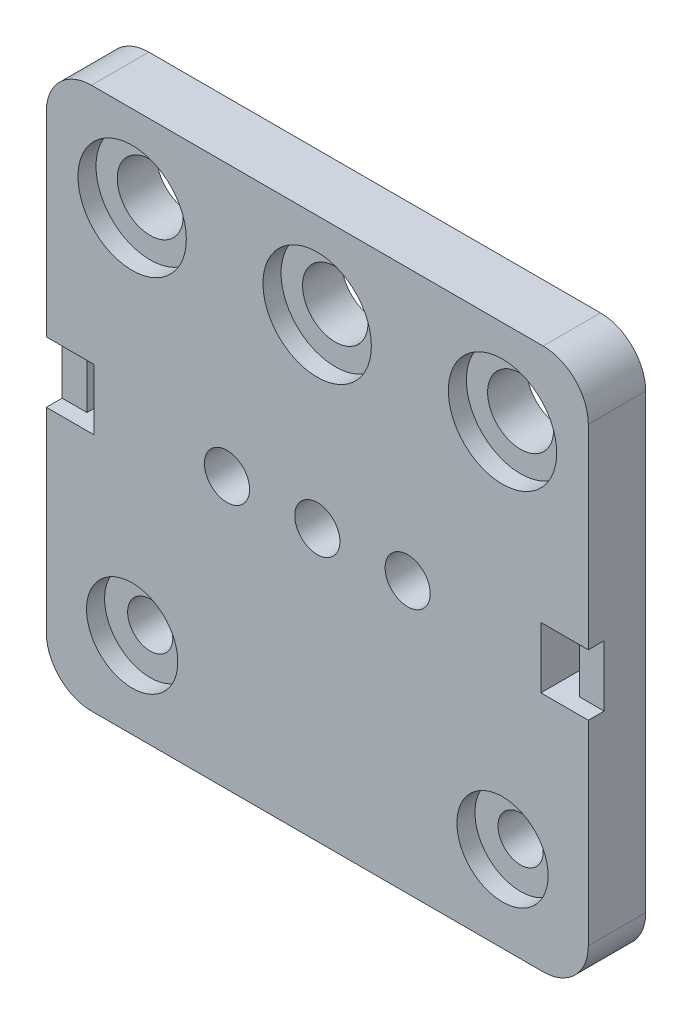
ISO-10303-21;
HEADER;
FILE_DESCRIPTION(('STEP AP214'),'2;1');
FILE_NAME('part.step','',(''),(''),'','','');
FILE_SCHEMA(('AUTOMOTIVE_DESIGN { 1 0 10303 214 1 1 1 1 }'));
ENDSEC;
DATA;
#1=APPLICATION_CONTEXT('core data for automotive mechanical design processes');
#2=APPLICATION_PROTOCOL_DEFINITION('international standard','automotive_design',2000,#1);
#3=PRODUCT_CONTEXT('',#1,'mechanical');
#4=PRODUCT('Part','Part','',(#3));
#5=PRODUCT_RELATED_PRODUCT_CATEGORY('part','',(#4));
#6=PRODUCT_DEFINITION_FORMATION('','',#4);
#7=PRODUCT_DEFINITION_CONTEXT('part definition',#1,'design');
#8=PRODUCT_DEFINITION('design','',#6,#7);
#9=PRODUCT_DEFINITION_SHAPE('','',#8);
#10=(LENGTH_UNIT() NAMED_UNIT(*) SI_UNIT(.MILLI.,.METRE.));
#11=(NAMED_UNIT(*) PLANE_ANGLE_UNIT() SI_UNIT($,.RADIAN.));
#12=(NAMED_UNIT(*) SI_UNIT($,.STERADIAN.) SOLID_ANGLE_UNIT());
#13=UNCERTAINTY_MEASURE_WITH_UNIT(LENGTH_MEASURE(1.E-05),#10,'distance_accuracy_value','');
#14=(GEOMETRIC_REPRESENTATION_CONTEXT(3) GLOBAL_UNCERTAINTY_ASSIGNED_CONTEXT((#13)) GLOBAL_UNIT_ASSIGNED_CONTEXT((#10,
#11,#12)) REPRESENTATION_CONTEXT('',''));
#15=CARTESIAN_POINT('',(0.,0.,0.));
#16=DIRECTION('',(0.,0.,1.));
#17=DIRECTION('',(1.,0.,0.));
#18=AXIS2_PLACEMENT_3D('',#15,#16,#17);
#19=CARTESIAN_POINT('',(-30.,30.,0.));
#20=DIRECTION('',(-1.,0.,0.));
#21=DIRECTION('',(0.,0.,1.));
#22=AXIS2_PLACEMENT_3D('',#19,#20,#21);
#23=PLANE('',#22);
#24=DIRECTION('',(0.,0.,1.));
#25=VECTOR('',#24,1.);
#26=CARTESIAN_POINT('',(-30.,3.375,3.175));
#27=LINE('',#26,#25);
#28=CARTESIAN_POINT('',(-30.,3.375,4.6));
#29=VERTEX_POINT('',#28);
#30=CARTESIAN_POINT('',(-30.,3.375,6.35));
#31=VERTEX_POINT('',#30);
#32=EDGE_CURVE('E313',#29,#31,#27,.T.);
#33=ORIENTED_EDGE('',*,*,#32,.T.);
#34=DIRECTION('',(0.,-1.,0.));
#35=VECTOR('',#34,1.);
#36=CARTESIAN_POINT('',(-30.,-30.,6.35));
#37=LINE('',#36,#35);
#38=CARTESIAN_POINT('',(-30.,25.,6.35));
#39=VERTEX_POINT('',#38);
#40=EDGE_CURVE('E498',#39,#31,#37,.T.);
#41=ORIENTED_EDGE('',*,*,#40,.F.);
#42=DIRECTION('',(0.,0.,1.));
#43=VECTOR('',#42,1.);
#44=CARTESIAN_POINT('',(-30.,25.,0.));
#45=LINE('',#44,#43);
#46=CARTESIAN_POINT('',(-30.,25.,0.));
#47=VERTEX_POINT('',#46);
#48=EDGE_CURVE('E248',#47,#39,#45,.T.);
#49=ORIENTED_EDGE('',*,*,#48,.F.);
#50=DIRECTION('',(0.,1.,0.));
#51=VECTOR('',#50,1.);
#52=CARTESIAN_POINT('',(-30.,-30.,0.));
#53=LINE('',#52,#51);
#54=CARTESIAN_POINT('',(-30.,-25.,0.));
#55=VERTEX_POINT('',#54);
#56=EDGE_CURVE('E211',#55,#47,#53,.T.);
#57=ORIENTED_EDGE('',*,*,#56,.F.);
#58=DIRECTION('',(0.,0.,-1.));
#59=VECTOR('',#58,1.);
#60=CARTESIAN_POINT('',(-30.,-25.,0.));
#61=LINE('',#60,#59);
#62=CARTESIAN_POINT('',(-30.,-25.,6.35));
#63=VERTEX_POINT('',#62);
#64=EDGE_CURVE('E285',#63,#55,#61,.T.);
#65=ORIENTED_EDGE('',*,*,#64,.F.);
#66=DIRECTION('',(0.,-1.,0.));
#67=VECTOR('',#66,1.);
#68=CARTESIAN_POINT('',(-30.,-30.,6.35));
#69=LINE('',#68,#67);
#70=CARTESIAN_POINT('',(-30.,-3.375,6.35));
#71=VERTEX_POINT('',#70);
#72=EDGE_CURVE('E411',#71,#63,#69,.T.);
#73=ORIENTED_EDGE('',*,*,#72,.F.);
#74=DIRECTION('',(0.,0.,-1.));
#75=VECTOR('',#74,1.);
#76=CARTESIAN_POINT('',(-30.,-3.375,3.175));
#77=LINE('',#76,#75);
#78=CARTESIAN_POINT('',(-30.,-3.375,4.6));
#79=VERTEX_POINT('',#78);
#80=EDGE_CURVE('E318',#71,#79,#77,.T.);
#81=ORIENTED_EDGE('',*,*,#80,.T.);
#82=DIRECTION('',(0.,1.,0.));
#83=VECTOR('',#82,1.);
#84=CARTESIAN_POINT('',(-30.,15.,4.6));
#85=LINE('',#84,#83);
#86=EDGE_CURVE('E459',#79,#29,#85,.T.);
#87=ORIENTED_EDGE('',*,*,#86,.T.);
#88=EDGE_LOOP('',(#33,#41,#49,#57,#65,#73,#81,#87));
#89=FACE_BOUND('',#88,.T.);
#90=ADVANCED_FACE('F17',(#89),#23,.T.);
#91=CARTESIAN_POINT('',(30.,-30.,0.));
#92=DIRECTION('',(1.,0.,0.));
#93=DIRECTION('',(0.,1.,0.));
#94=AXIS2_PLACEMENT_3D('',#91,#92,#93);
#95=PLANE('',#94);
#96=DIRECTION('',(0.,0.,1.));
#97=VECTOR('',#96,1.);
#98=CARTESIAN_POINT('',(30.,-3.375,3.175));
#99=LINE('',#98,#97);
#100=CARTESIAN_POINT('',(30.,-3.375,4.6));
#101=VERTEX_POINT('',#100);
#102=CARTESIAN_POINT('',(30.,-3.375,6.35));
#103=VERTEX_POINT('',#102);
#104=EDGE_CURVE('E281',#101,#103,#99,.T.);
#105=ORIENTED_EDGE('',*,*,#104,.T.);
#106=DIRECTION('',(0.,1.,0.));
#107=VECTOR('',#106,1.);
#108=CARTESIAN_POINT('',(30.,30.,6.35));
#109=LINE('',#108,#107);
#110=CARTESIAN_POINT('',(30.,-25.,6.35));
#111=VERTEX_POINT('',#110);
#112=EDGE_CURVE('E511',#111,#103,#109,.T.);
#113=ORIENTED_EDGE('',*,*,#112,.F.);
#114=DIRECTION('',(0.,0.,1.));
#115=VECTOR('',#114,1.);
#116=CARTESIAN_POINT('',(30.,-25.,0.));
#117=LINE('',#116,#115);
#118=CARTESIAN_POINT('',(30.,-25.,0.));
#119=VERTEX_POINT('',#118);
#120=EDGE_CURVE('E37',#119,#111,#117,.T.);
#121=ORIENTED_EDGE('',*,*,#120,.F.);
#122=DIRECTION('',(0.,-1.,0.));
#123=VECTOR('',#122,1.);
#124=CARTESIAN_POINT('',(30.,30.,0.));
#125=LINE('',#124,#123);
#126=CARTESIAN_POINT('',(30.,25.,0.));
#127=VERTEX_POINT('',#126);
#128=EDGE_CURVE('E197',#127,#119,#125,.T.);
#129=ORIENTED_EDGE('',*,*,#128,.F.);
#130=DIRECTION('',(0.,0.,-1.));
#131=VECTOR('',#130,1.);
#132=CARTESIAN_POINT('',(30.,25.,0.));
#133=LINE('',#132,#131);
#134=CARTESIAN_POINT('',(30.,25.,6.35));
#135=VERTEX_POINT('',#134);
#136=EDGE_CURVE('E50',#135,#127,#133,.T.);
#137=ORIENTED_EDGE('',*,*,#136,.F.);
#138=DIRECTION('',(0.,1.,0.));
#139=VECTOR('',#138,1.);
#140=CARTESIAN_POINT('',(30.,30.,6.35));
#141=LINE('',#140,#139);
#142=CARTESIAN_POINT('',(30.,3.375,6.35));
#143=VERTEX_POINT('',#142);
#144=EDGE_CURVE('E480',#143,#135,#141,.T.);
#145=ORIENTED_EDGE('',*,*,#144,.F.);
#146=DIRECTION('',(0.,0.,-1.));
#147=VECTOR('',#146,1.);
#148=CARTESIAN_POINT('',(30.,3.375,3.175));
#149=LINE('',#148,#147);
#150=CARTESIAN_POINT('',(30.,3.375,4.6));
#151=VERTEX_POINT('',#150);
#152=EDGE_CURVE('E273',#143,#151,#149,.T.);
#153=ORIENTED_EDGE('',*,*,#152,.T.);
#154=DIRECTION('',(0.,-1.,0.));
#155=VECTOR('',#154,1.);
#156=CARTESIAN_POINT('',(30.,-15.,4.6));
#157=LINE('',#156,#155);
#158=EDGE_CURVE('E424',#151,#101,#157,.T.);
#159=ORIENTED_EDGE('',*,*,#158,.T.);
#160=EDGE_LOOP('',(#105,#113,#121,#129,#137,#145,#153,#159));
#161=FACE_BOUND('',#160,.T.);
#162=ADVANCED_FACE('F577',(#161),#95,.T.);
#163=CARTESIAN_POINT('',(20.5,-20.5,6.35));
#164=DIRECTION('',(0.,0.,-1.));
#165=DIRECTION('',(1.,0.,0.));
#166=AXIS2_PLACEMENT_3D('',#163,#164,#165);
#167=CYLINDRICAL_SURFACE('',#166,2.5);
#168=CARTESIAN_POINT('',(20.5,-20.5,0.));
#169=DIRECTION('',(0.,0.,1.));
#170=DIRECTION('',(1.,0.,0.));
#171=AXIS2_PLACEMENT_3D('',#168,#169,#170);
#172=CIRCLE('',#171,2.5);
#173=CARTESIAN_POINT('',(23.,-20.5,0.));
#174=VERTEX_POINT('',#173);
#175=EDGE_CURVE('E241',#174,#174,#172,.T.);
#176=ORIENTED_EDGE('',*,*,#175,.F.);
#177=EDGE_LOOP('',(#176));
#178=FACE_BOUND('',#177,.T.);
#179=CARTESIAN_POINT('',(20.5,-20.5,4.35));
#180=DIRECTION('',(0.,0.,1.));
#181=DIRECTION('',(1.,0.,0.));
#182=AXIS2_PLACEMENT_3D('',#179,#180,#181);
#183=CIRCLE('',#182,2.5);
#184=CARTESIAN_POINT('',(23.,-20.5,4.35));
#185=VERTEX_POINT('',#184);
#186=EDGE_CURVE('E254',#185,#185,#183,.T.);
#187=ORIENTED_EDGE('',*,*,#186,.T.);
#188=EDGE_LOOP('',(#187));
#189=FACE_BOUND('',#188,.T.);
#190=ADVANCED_FACE('F583',(#178,#189),#167,.F.);
#191=CARTESIAN_POINT('',(-20.5,-20.5,6.35));
#192=DIRECTION('',(0.,0.,-1.));
#193=DIRECTION('',(1.,0.,0.));
#194=AXIS2_PLACEMENT_3D('',#191,#192,#193);
#195=CYLINDRICAL_SURFACE('',#194,2.5);
#196=CARTESIAN_POINT('',(-20.5,-20.5,0.));
#197=DIRECTION('',(0.,0.,1.));
#198=DIRECTION('',(1.,0.,0.));
#199=AXIS2_PLACEMENT_3D('',#196,#197,#198);
#200=CIRCLE('',#199,2.5);
#201=CARTESIAN_POINT('',(-18.,-20.5,0.));
#202=VERTEX_POINT('',#201);
#203=EDGE_CURVE('E200',#202,#202,#200,.T.);
#204=ORIENTED_EDGE('',*,*,#203,.F.);
#205=EDGE_LOOP('',(#204));
#206=FACE_BOUND('',#205,.T.);
#207=CARTESIAN_POINT('',(-20.5,-20.5,4.35));
#208=DIRECTION('',(0.,0.,1.));
#209=DIRECTION('',(1.,0.,0.));
#210=AXIS2_PLACEMENT_3D('',#207,#208,#209);
#211=CIRCLE('',#210,2.5);
#212=CARTESIAN_POINT('',(-18.,-20.5,4.35));
#213=VERTEX_POINT('',#212);
#214=EDGE_CURVE('E11',#213,#213,#211,.T.);
#215=ORIENTED_EDGE('',*,*,#214,.T.);
#216=EDGE_LOOP('',(#215));
#217=FACE_BOUND('',#216,.T.);
#218=ADVANCED_FACE('F790',(#206,#217),#195,.F.);
#219=CARTESIAN_POINT('',(-20.5,-20.5,4.35));
#220=DIRECTION('',(0.,0.,1.));
#221=DIRECTION('',(1.,0.,0.));
#222=AXIS2_PLACEMENT_3D('',#219,#220,#221);
#223=PLANE('',#222);
#224=ORIENTED_EDGE('',*,*,#214,.F.);
#225=EDGE_LOOP('',(#224));
#226=FACE_BOUND('',#225,.T.);
#227=CARTESIAN_POINT('',(-20.5,-20.5,4.35));
#228=DIRECTION('',(0.,0.,-1.));
#229=DIRECTION('',(1.,0.,0.));
#230=AXIS2_PLACEMENT_3D('',#227,#228,#229);
#231=CIRCLE('',#230,5.05);
#232=CARTESIAN_POINT('',(-15.45,-20.5,4.35));
#233=VERTEX_POINT('',#232);
#234=EDGE_CURVE('E20',#233,#233,#231,.T.);
#235=ORIENTED_EDGE('',*,*,#234,.F.);
#236=EDGE_LOOP('',(#235));
#237=FACE_BOUND('',#236,.T.);
#238=ADVANCED_FACE('F793',(#226,#237),#223,.T.);
#239=CARTESIAN_POINT('',(-20.5,-20.5,6.35));
#240=DIRECTION('',(0.,0.,-1.));
#241=DIRECTION('',(1.,0.,0.));
#242=AXIS2_PLACEMENT_3D('',#239,#240,#241);
#243=CYLINDRICAL_SURFACE('',#242,5.05);
#244=CARTESIAN_POINT('',(-20.5,-20.5,6.35));
#245=DIRECTION('',(0.,0.,-1.));
#246=DIRECTION('',(1.,0.,0.));
#247=AXIS2_PLACEMENT_3D('',#244,#245,#246);
#248=CIRCLE('',#247,5.05);
#249=CARTESIAN_POINT('',(-15.45,-20.5,6.35));
#250=VERTEX_POINT('',#249);
#251=EDGE_CURVE('E529',#250,#250,#248,.T.);
#252=ORIENTED_EDGE('',*,*,#251,.F.);
#253=EDGE_LOOP('',(#252));
#254=FACE_BOUND('',#253,.T.);
#255=ORIENTED_EDGE('',*,*,#234,.T.);
#256=EDGE_LOOP('',(#255));
#257=FACE_BOUND('',#256,.T.);
#258=ADVANCED_FACE('F1142',(#254,#257),#243,.F.);
#259=CARTESIAN_POINT('',(-20.5,20.5,4.35));
#260=DIRECTION('',(0.,0.,1.));
#261=DIRECTION('',(1.,0.,0.));
#262=AXIS2_PLACEMENT_3D('',#259,#260,#261);
#263=PLANE('',#262);
#264=CARTESIAN_POINT('',(-20.5,20.5,4.35));
#265=DIRECTION('',(0.,0.,-1.));
#266=DIRECTION('',(1.,0.,0.));
#267=AXIS2_PLACEMENT_3D('',#264,#265,#266);
#268=CIRCLE('',#267,3.65);
#269=CARTESIAN_POINT('',(-16.85,20.5,4.35));
#270=VERTEX_POINT('',#269);
#271=EDGE_CURVE('E371',#270,#270,#268,.T.);
#272=ORIENTED_EDGE('',*,*,#271,.T.);
#273=EDGE_LOOP('',(#272));
#274=FACE_BOUND('',#273,.T.);
#275=CARTESIAN_POINT('',(-20.5,20.5,4.35));
#276=DIRECTION('',(0.,0.,-1.));
#277=DIRECTION('',(1.,0.,0.));
#278=AXIS2_PLACEMENT_3D('',#275,#276,#277);
#279=CIRCLE('',#278,6.);
#280=CARTESIAN_POINT('',(-14.5,20.5,4.35));
#281=VERTEX_POINT('',#280);
#282=EDGE_CURVE('E375',#281,#281,#279,.T.);
#283=ORIENTED_EDGE('',*,*,#282,.F.);
#284=EDGE_LOOP('',(#283));
#285=FACE_BOUND('',#284,.T.);
#286=ADVANCED_FACE('F786',(#274,#285),#263,.T.);
#287=CARTESIAN_POINT('',(20.5,-20.5,4.35));
#288=DIRECTION('',(0.,0.,1.));
#289=DIRECTION('',(1.,0.,0.));
#290=AXIS2_PLACEMENT_3D('',#287,#288,#289);
#291=PLANE('',#290);
#292=ORIENTED_EDGE('',*,*,#186,.F.);
#293=EDGE_LOOP('',(#292));
#294=FACE_BOUND('',#293,.T.);
#295=CARTESIAN_POINT('',(20.5,-20.5,4.35));
#296=DIRECTION('',(0.,0.,-1.));
#297=DIRECTION('',(1.,0.,0.));
#298=AXIS2_PLACEMENT_3D('',#295,#296,#297);
#299=CIRCLE('',#298,5.05);
#300=CARTESIAN_POINT('',(25.55,-20.5,4.35));
#301=VERTEX_POINT('',#300);
#302=EDGE_CURVE('E253',#301,#301,#299,.T.);
#303=ORIENTED_EDGE('',*,*,#302,.F.);
#304=EDGE_LOOP('',(#303));
#305=FACE_BOUND('',#304,.T.);
#306=ADVANCED_FACE('F573',(#294,#305),#291,.T.);
#307=CARTESIAN_POINT('',(20.5,-20.5,6.35));
#308=DIRECTION('',(0.,0.,-1.));
#309=DIRECTION('',(1.,0.,0.));
#310=AXIS2_PLACEMENT_3D('',#307,#308,#309);
#311=CYLINDRICAL_SURFACE('',#310,5.05);
#312=CARTESIAN_POINT('',(20.5,-20.5,6.35));
#313=DIRECTION('',(0.,0.,-1.));
#314=DIRECTION('',(1.,0.,0.));
#315=AXIS2_PLACEMENT_3D('',#312,#313,#314);
#316=CIRCLE('',#315,5.05);
#317=CARTESIAN_POINT('',(25.55,-20.5,6.35));
#318=VERTEX_POINT('',#317);
#319=EDGE_CURVE('E533',#318,#318,#316,.T.);
#320=ORIENTED_EDGE('',*,*,#319,.F.);
#321=EDGE_LOOP('',(#320));
#322=FACE_BOUND('',#321,.T.);
#323=ORIENTED_EDGE('',*,*,#302,.T.);
#324=EDGE_LOOP('',(#323));
#325=FACE_BOUND('',#324,.T.);
#326=ADVANCED_FACE('F562',(#322,#325),#311,.F.);
#327=CARTESIAN_POINT('',(20.5,20.5,4.35));
#328=DIRECTION('',(0.,0.,1.));
#329=DIRECTION('',(1.,0.,0.));
#330=AXIS2_PLACEMENT_3D('',#327,#328,#329);
#331=PLANE('',#330);
#332=CARTESIAN_POINT('',(20.5,20.5,4.35));
#333=DIRECTION('',(0.,0.,-1.));
#334=DIRECTION('',(1.,0.,0.));
#335=AXIS2_PLACEMENT_3D('',#332,#333,#334);
#336=CIRCLE('',#335,3.65);
#337=CARTESIAN_POINT('',(24.15,20.5,4.35));
#338=VERTEX_POINT('',#337);
#339=EDGE_CURVE('E370',#338,#338,#336,.T.);
#340=ORIENTED_EDGE('',*,*,#339,.T.);
#341=EDGE_LOOP('',(#340));
#342=FACE_BOUND('',#341,.T.);
#343=CARTESIAN_POINT('',(20.5,20.5,4.35));
#344=DIRECTION('',(0.,0.,-1.));
#345=DIRECTION('',(1.,0.,0.));
#346=AXIS2_PLACEMENT_3D('',#343,#344,#345);
#347=CIRCLE('',#346,6.);
#348=CARTESIAN_POINT('',(26.5,20.5,4.35));
#349=VERTEX_POINT('',#348);
#350=EDGE_CURVE('E380',#349,#349,#347,.T.);
#351=ORIENTED_EDGE('',*,*,#350,.F.);
#352=EDGE_LOOP('',(#351));
#353=FACE_BOUND('',#352,.T.);
#354=ADVANCED_FACE('F560',(#342,#353),#331,.T.);
#355=CARTESIAN_POINT('',(25.,-25.,0.));
#356=DIRECTION('',(0.,0.,1.));
#357=DIRECTION('',(0.707106781186548,-0.707106781186548,0.));
#358=AXIS2_PLACEMENT_3D('',#355,#356,#357);
#359=CYLINDRICAL_SURFACE('',#358,5.);
#360=CARTESIAN_POINT('',(25.,-25.,6.35));
#361=DIRECTION('',(0.,0.,-1.));
#362=DIRECTION('',(0.707106781186548,-0.707106781186548,0.));
#363=AXIS2_PLACEMENT_3D('',#360,#361,#362);
#364=CIRCLE('',#363,5.);
#365=CARTESIAN_POINT('',(25.,-30.,6.35));
#366=VERTEX_POINT('',#365);
#367=EDGE_CURVE('E206',#111,#366,#364,.T.);
#368=ORIENTED_EDGE('',*,*,#367,.T.);
#369=DIRECTION('',(0.,0.,-1.));
#370=VECTOR('',#369,1.);
#371=CARTESIAN_POINT('',(25.,-30.,0.));
#372=LINE('',#371,#370);
#373=CARTESIAN_POINT('',(25.,-30.,0.));
#374=VERTEX_POINT('',#373);
#375=EDGE_CURVE('E203',#366,#374,#372,.T.);
#376=ORIENTED_EDGE('',*,*,#375,.T.);
#377=CARTESIAN_POINT('',(25.,-25.,0.));
#378=DIRECTION('',(0.,0.,1.));
#379=DIRECTION('',(0.707106781186548,-0.707106781186548,0.));
#380=AXIS2_PLACEMENT_3D('',#377,#378,#379);
#381=CIRCLE('',#380,5.);
#382=EDGE_CURVE('E189',#374,#119,#381,.T.);
#383=ORIENTED_EDGE('',*,*,#382,.T.);
#384=ORIENTED_EDGE('',*,*,#120,.T.);
#385=EDGE_LOOP('',(#368,#376,#383,#384));
#386=FACE_BOUND('',#385,.T.);
#387=ADVANCED_FACE('F204',(#386),#359,.T.);
#388=CARTESIAN_POINT('',(25.,25.,0.));
#389=DIRECTION('',(0.,0.,1.));
#390=DIRECTION('',(0.707106781186548,0.707106781186548,0.));
#391=AXIS2_PLACEMENT_3D('',#388,#389,#390);
#392=CYLINDRICAL_SURFACE('',#391,5.);
#393=CARTESIAN_POINT('',(25.,25.,6.35));
#394=DIRECTION('',(0.,0.,-1.));
#395=DIRECTION('',(0.707106781186548,0.707106781186548,0.));
#396=AXIS2_PLACEMENT_3D('',#393,#394,#395);
#397=CIRCLE('',#396,5.);
#398=CARTESIAN_POINT('',(25.,30.,6.35));
#399=VERTEX_POINT('',#398);
#400=EDGE_CURVE('E484',#399,#135,#397,.T.);
#401=ORIENTED_EDGE('',*,*,#400,.T.);
#402=ORIENTED_EDGE('',*,*,#136,.T.);
#403=CARTESIAN_POINT('',(25.,25.,0.));
#404=DIRECTION('',(0.,0.,1.));
#405=DIRECTION('',(0.707106781186548,0.707106781186548,0.));
#406=AXIS2_PLACEMENT_3D('',#403,#404,#405);
#407=CIRCLE('',#406,5.);
#408=CARTESIAN_POINT('',(25.,30.,0.));
#409=VERTEX_POINT('',#408);
#410=EDGE_CURVE('E234',#127,#409,#407,.T.);
#411=ORIENTED_EDGE('',*,*,#410,.T.);
#412=DIRECTION('',(0.,0.,1.));
#413=VECTOR('',#412,1.);
#414=CARTESIAN_POINT('',(25.,30.,0.));
#415=LINE('',#414,#413);
#416=EDGE_CURVE('E249',#409,#399,#415,.T.);
#417=ORIENTED_EDGE('',*,*,#416,.T.);
#418=EDGE_LOOP('',(#401,#402,#411,#417));
#419=FACE_BOUND('',#418,.T.);
#420=ADVANCED_FACE('F570',(#419),#392,.T.);
#421=CARTESIAN_POINT('',(30.,30.,0.));
#422=DIRECTION('',(0.,1.,0.));
#423=DIRECTION('',(1.,0.,0.));
#424=AXIS2_PLACEMENT_3D('',#421,#422,#423);
#425=PLANE('',#424);
#426=DIRECTION('',(0.,0.,-1.));
#427=VECTOR('',#426,1.);
#428=CARTESIAN_POINT('',(-25.,30.,0.));
#429=LINE('',#428,#427);
#430=CARTESIAN_POINT('',(-25.,30.,6.35));
#431=VERTEX_POINT('',#430);
#432=CARTESIAN_POINT('',(-25.,30.,0.));
#433=VERTEX_POINT('',#432);
#434=EDGE_CURVE('E245',#431,#433,#429,.T.);
#435=ORIENTED_EDGE('',*,*,#434,.F.);
#436=DIRECTION('',(-1.,0.,0.));
#437=VECTOR('',#436,1.);
#438=CARTESIAN_POINT('',(-30.,30.,6.35));
#439=LINE('',#438,#437);
#440=EDGE_CURVE('E487',#399,#431,#439,.T.);
#441=ORIENTED_EDGE('',*,*,#440,.F.);
#442=ORIENTED_EDGE('',*,*,#416,.F.);
#443=DIRECTION('',(1.,0.,0.));
#444=VECTOR('',#443,1.);
#445=CARTESIAN_POINT('',(-30.,30.,0.));
#446=LINE('',#445,#444);
#447=EDGE_CURVE('E230',#433,#409,#446,.T.);
#448=ORIENTED_EDGE('',*,*,#447,.F.);
#449=EDGE_LOOP('',(#435,#441,#442,#448));
#450=FACE_BOUND('',#449,.T.);
#451=ADVANCED_FACE('F601',(#450),#425,.T.);
#452=CARTESIAN_POINT('',(-25.,25.,0.));
#453=DIRECTION('',(0.,0.,1.));
#454=DIRECTION('',(-0.707106781186548,0.707106781186548,0.));
#455=AXIS2_PLACEMENT_3D('',#452,#453,#454);
#456=CYLINDRICAL_SURFACE('',#455,5.);
#457=CARTESIAN_POINT('',(-25.,25.,6.35));
#458=DIRECTION('',(0.,0.,-1.));
#459=DIRECTION('',(-0.707106781186548,0.707106781186548,0.));
#460=AXIS2_PLACEMENT_3D('',#457,#458,#459);
#461=CIRCLE('',#460,5.);
#462=EDGE_CURVE('E491',#39,#431,#461,.T.);
#463=ORIENTED_EDGE('',*,*,#462,.T.);
#464=ORIENTED_EDGE('',*,*,#434,.T.);
#465=CARTESIAN_POINT('',(-25.,25.,0.));
#466=DIRECTION('',(0.,0.,1.));
#467=DIRECTION('',(-0.707106781186548,0.707106781186548,0.));
#468=AXIS2_PLACEMENT_3D('',#465,#466,#467);
#469=CIRCLE('',#468,5.);
#470=EDGE_CURVE('E226',#433,#47,#469,.T.);
#471=ORIENTED_EDGE('',*,*,#470,.T.);
#472=ORIENTED_EDGE('',*,*,#48,.T.);
#473=EDGE_LOOP('',(#463,#464,#471,#472));
#474=FACE_BOUND('',#473,.T.);
#475=ADVANCED_FACE('F598',(#474),#456,.T.);
#476=CARTESIAN_POINT('',(0.,0.,0.));
#477=DIRECTION('',(0.,0.,1.));
#478=DIRECTION('',(1.,0.,0.));
#479=AXIS2_PLACEMENT_3D('',#476,#477,#478);
#480=PLANE('',#479);
#481=ORIENTED_EDGE('',*,*,#175,.T.);
#482=EDGE_LOOP('',(#481));
#483=FACE_BOUND('',#482,.T.);
#484=ORIENTED_EDGE('',*,*,#203,.T.);
#485=EDGE_LOOP('',(#484));
#486=FACE_BOUND('',#485,.T.);
#487=DIRECTION('',(0.,1.,0.));
#488=VECTOR('',#487,1.);
#489=CARTESIAN_POINT('',(27.2500004023314,1.6875,0.));
#490=LINE('',#489,#488);
#491=CARTESIAN_POINT('',(27.2500004023314,-3.375,0.));
#492=VERTEX_POINT('',#491);
#493=CARTESIAN_POINT('',(27.2500004023314,3.375,0.));
#494=VERTEX_POINT('',#493);
#495=EDGE_CURVE('E337',#492,#494,#490,.T.);
#496=ORIENTED_EDGE('',*,*,#495,.T.);
#497=DIRECTION('',(-1.,0.,0.));
#498=VECTOR('',#497,1.);
#499=CARTESIAN_POINT('',(12.8750002011657,3.375,0.));
#500=LINE('',#499,#498);
#501=CARTESIAN_POINT('',(24.7500004023314,3.375,0.));
#502=VERTEX_POINT('',#501);
#503=EDGE_CURVE('E271',#494,#502,#500,.T.);
#504=ORIENTED_EDGE('',*,*,#503,.T.);
#505=DIRECTION('',(0.,-1.,0.));
#506=VECTOR('',#505,1.);
#507=CARTESIAN_POINT('',(24.7500004023314,-1.6875,0.));
#508=LINE('',#507,#506);
#509=CARTESIAN_POINT('',(24.7500004023314,-3.375,0.));
#510=VERTEX_POINT('',#509);
#511=EDGE_CURVE('E335',#502,#510,#508,.T.);
#512=ORIENTED_EDGE('',*,*,#511,.T.);
#513=DIRECTION('',(1.,0.,0.));
#514=VECTOR('',#513,1.);
#515=CARTESIAN_POINT('',(14.1250002011657,-3.375,0.));
#516=LINE('',#515,#514);
#517=EDGE_CURVE('E277',#510,#492,#516,.T.);
#518=ORIENTED_EDGE('',*,*,#517,.T.);
#519=EDGE_LOOP('',(#496,#504,#512,#518));
#520=FACE_BOUND('',#519,.T.);
#521=DIRECTION('',(0.,1.,0.));
#522=VECTOR('',#521,1.);
#523=CARTESIAN_POINT('',(-24.7500004023314,1.6875,0.));
#524=LINE('',#523,#522);
#525=CARTESIAN_POINT('',(-24.7500004023314,-3.375,0.));
#526=VERTEX_POINT('',#525);
#527=CARTESIAN_POINT('',(-24.7500004023314,3.375,0.));
#528=VERTEX_POINT('',#527);
#529=EDGE_CURVE('E303',#526,#528,#524,.T.);
#530=ORIENTED_EDGE('',*,*,#529,.T.);
#531=DIRECTION('',(-1.,0.,0.));
#532=VECTOR('',#531,1.);
#533=CARTESIAN_POINT('',(-14.1250002011657,3.375,0.));
#534=LINE('',#533,#532);
#535=CARTESIAN_POINT('',(-27.2500004023314,3.375,0.));
#536=VERTEX_POINT('',#535);
#537=EDGE_CURVE('E309',#528,#536,#534,.T.);
#538=ORIENTED_EDGE('',*,*,#537,.T.);
#539=DIRECTION('',(0.,-1.,0.));
#540=VECTOR('',#539,1.);
#541=CARTESIAN_POINT('',(-27.2500004023314,-1.6875,0.));
#542=LINE('',#541,#540);
#543=CARTESIAN_POINT('',(-27.2500004023314,-3.375,0.));
#544=VERTEX_POINT('',#543);
#545=EDGE_CURVE('E366',#536,#544,#542,.T.);
#546=ORIENTED_EDGE('',*,*,#545,.T.);
#547=DIRECTION('',(1.,0.,0.));
#548=VECTOR('',#547,1.);
#549=CARTESIAN_POINT('',(-12.8750002011657,-3.375,0.));
#550=LINE('',#549,#548);
#551=EDGE_CURVE('E316',#544,#526,#550,.T.);
#552=ORIENTED_EDGE('',*,*,#551,.T.);
#553=EDGE_LOOP('',(#530,#538,#546,#552));
#554=FACE_BOUND('',#553,.T.);
#555=CARTESIAN_POINT('',(10.0000001490116,0.,0.));
#556=DIRECTION('',(0.,0.,1.));
#557=DIRECTION('',(1.,0.,0.));
#558=AXIS2_PLACEMENT_3D('',#555,#556,#557);
#559=CIRCLE('',#558,2.5);
#560=CARTESIAN_POINT('',(12.5000001490116,0.,0.));
#561=VERTEX_POINT('',#560);
#562=EDGE_CURVE('E390',#561,#561,#559,.T.);
#563=ORIENTED_EDGE('',*,*,#562,.T.);
#564=EDGE_LOOP('',(#563));
#565=FACE_BOUND('',#564,.T.);
#566=CARTESIAN_POINT('',(-10.0000001490116,0.,0.));
#567=DIRECTION('',(0.,0.,1.));
#568=DIRECTION('',(1.,0.,0.));
#569=AXIS2_PLACEMENT_3D('',#566,#567,#568);
#570=CIRCLE('',#569,2.5);
#571=CARTESIAN_POINT('',(-7.5000001490116,0.,0.));
#572=VERTEX_POINT('',#571);
#573=EDGE_CURVE('E387',#572,#572,#570,.T.);
#574=ORIENTED_EDGE('',*,*,#573,.T.);
#575=EDGE_LOOP('',(#574));
#576=FACE_BOUND('',#575,.T.);
#577=CARTESIAN_POINT('',(0.,0.,0.));
#578=DIRECTION('',(0.,0.,1.));
#579=DIRECTION('',(1.,0.,0.));
#580=AXIS2_PLACEMENT_3D('',#577,#578,#579);
#581=CIRCLE('',#580,2.5);
#582=CARTESIAN_POINT('',(2.5,0.,0.));
#583=VERTEX_POINT('',#582);
#584=EDGE_CURVE('E384',#583,#583,#581,.T.);
#585=ORIENTED_EDGE('',*,*,#584,.T.);
#586=EDGE_LOOP('',(#585));
#587=FACE_BOUND('',#586,.T.);
#588=CARTESIAN_POINT('',(-20.5,20.5,0.));
#589=DIRECTION('',(0.,0.,1.));
#590=DIRECTION('',(1.,0.,0.));
#591=AXIS2_PLACEMENT_3D('',#588,#589,#590);
#592=CIRCLE('',#591,3.65);
#593=CARTESIAN_POINT('',(-16.85,20.5,0.));
#594=VERTEX_POINT('',#593);
#595=EDGE_CURVE('E376',#594,#594,#592,.T.);
#596=ORIENTED_EDGE('',*,*,#595,.T.);
#597=EDGE_LOOP('',(#596));
#598=FACE_BOUND('',#597,.T.);
#599=CARTESIAN_POINT('',(20.5,20.5,0.));
#600=DIRECTION('',(0.,0.,1.));
#601=DIRECTION('',(1.,0.,0.));
#602=AXIS2_PLACEMENT_3D('',#599,#600,#601);
#603=CIRCLE('',#602,3.65);
#604=CARTESIAN_POINT('',(24.15,20.5,0.));
#605=VERTEX_POINT('',#604);
#606=EDGE_CURVE('E365',#605,#605,#603,.T.);
#607=ORIENTED_EDGE('',*,*,#606,.T.);
#608=EDGE_LOOP('',(#607));
#609=FACE_BOUND('',#608,.T.);
#610=CARTESIAN_POINT('',(-0.0170614570448313,20.5,0.));
#611=DIRECTION('',(0.,0.,1.));
#612=DIRECTION('',(1.,0.,0.));
#613=AXIS2_PLACEMENT_3D('',#610,#611,#612);
#614=CIRCLE('',#613,3.625);
#615=CARTESIAN_POINT('',(3.60793854295517,20.5,0.));
#616=VERTEX_POINT('',#615);
#617=EDGE_CURVE('E431',#616,#616,#614,.T.);
#618=ORIENTED_EDGE('',*,*,#617,.T.);
#619=EDGE_LOOP('',(#618));
#620=FACE_BOUND('',#619,.T.);
#621=CARTESIAN_POINT('',(-25.,-25.,0.));
#622=DIRECTION('',(0.,0.,1.));
#623=DIRECTION('',(-0.707106781186548,-0.707106781186548,0.));
#624=AXIS2_PLACEMENT_3D('',#621,#622,#623);
#625=CIRCLE('',#624,5.);
#626=CARTESIAN_POINT('',(-25.,-30.,0.));
#627=VERTEX_POINT('',#626);
#628=EDGE_CURVE('E222',#55,#627,#625,.T.);
#629=ORIENTED_EDGE('',*,*,#628,.F.);
#630=ORIENTED_EDGE('',*,*,#56,.T.);
#631=ORIENTED_EDGE('',*,*,#470,.F.);
#632=ORIENTED_EDGE('',*,*,#447,.T.);
#633=ORIENTED_EDGE('',*,*,#410,.F.);
#634=ORIENTED_EDGE('',*,*,#128,.T.);
#635=ORIENTED_EDGE('',*,*,#382,.F.);
#636=DIRECTION('',(-1.,0.,0.));
#637=VECTOR('',#636,1.);
#638=CARTESIAN_POINT('',(30.,-30.,0.));
#639=LINE('',#638,#637);
#640=EDGE_CURVE('E194',#374,#627,#639,.T.);
#641=ORIENTED_EDGE('',*,*,#640,.T.);
#642=EDGE_LOOP('',(#629,#630,#631,#632,#633,#634,#635,#641));
#643=FACE_BOUND('',#642,.T.);
#644=ADVANCED_FACE('F192',(#483,#486,#520,#554,#565,#576,#587,#598,#609,#620,#643),#480,.F.);
#645=CARTESIAN_POINT('',(-30.,-30.,0.));
#646=DIRECTION('',(0.,-1.,0.));
#647=DIRECTION('',(0.,0.,-1.));
#648=AXIS2_PLACEMENT_3D('',#645,#646,#647);
#649=PLANE('',#648);
#650=DIRECTION('',(0.,0.,1.));
#651=VECTOR('',#650,1.);
#652=CARTESIAN_POINT('',(-25.,-30.,0.));
#653=LINE('',#652,#651);
#654=CARTESIAN_POINT('',(-25.,-30.,6.35));
#655=VERTEX_POINT('',#654);
#656=EDGE_CURVE('E214',#627,#655,#653,.T.);
#657=ORIENTED_EDGE('',*,*,#656,.F.);
#658=ORIENTED_EDGE('',*,*,#640,.F.);
#659=ORIENTED_EDGE('',*,*,#375,.F.);
#660=DIRECTION('',(1.,0.,0.));
#661=VECTOR('',#660,1.);
#662=CARTESIAN_POINT('',(30.,-30.,6.35));
#663=LINE('',#662,#661);
#664=EDGE_CURVE('E512',#655,#366,#663,.T.);
#665=ORIENTED_EDGE('',*,*,#664,.F.);
#666=EDGE_LOOP('',(#657,#658,#659,#665));
#667=FACE_BOUND('',#666,.T.);
#668=ADVANCED_FACE('F213',(#667),#649,.T.);
#669=CARTESIAN_POINT('',(-25.,-25.,0.));
#670=DIRECTION('',(0.,0.,1.));
#671=DIRECTION('',(-0.707106781186548,-0.707106781186548,0.));
#672=AXIS2_PLACEMENT_3D('',#669,#670,#671);
#673=CYLINDRICAL_SURFACE('',#672,5.);
#674=CARTESIAN_POINT('',(-25.,-25.,6.35));
#675=DIRECTION('',(0.,0.,-1.));
#676=DIRECTION('',(-0.707106781186548,-0.707106781186548,0.));
#677=AXIS2_PLACEMENT_3D('',#674,#675,#676);
#678=CIRCLE('',#677,5.);
#679=EDGE_CURVE('E519',#655,#63,#678,.T.);
#680=ORIENTED_EDGE('',*,*,#679,.T.);
#681=ORIENTED_EDGE('',*,*,#64,.T.);
#682=ORIENTED_EDGE('',*,*,#628,.T.);
#683=ORIENTED_EDGE('',*,*,#656,.T.);
#684=EDGE_LOOP('',(#680,#681,#682,#683));
#685=FACE_BOUND('',#684,.T.);
#686=ADVANCED_FACE('F292',(#685),#673,.T.);
#687=CARTESIAN_POINT('',(28.2500004023314,-3.375,6.35));
#688=DIRECTION('',(0.,-1.,0.));
#689=DIRECTION('',(0.,0.,-1.));
#690=AXIS2_PLACEMENT_3D('',#687,#688,#689);
#691=PLANE('',#690);
#692=ORIENTED_EDGE('',*,*,#517,.F.);
#693=DIRECTION('',(0.,0.,-1.));
#694=VECTOR('',#693,1.);
#695=CARTESIAN_POINT('',(24.7500004023314,-3.375,6.35));
#696=LINE('',#695,#694);
#697=CARTESIAN_POINT('',(24.7500004023314,-3.375,6.35));
#698=VERTEX_POINT('',#697);
#699=EDGE_CURVE('E282',#698,#510,#696,.T.);
#700=ORIENTED_EDGE('',*,*,#699,.F.);
#701=DIRECTION('',(-1.,0.,0.));
#702=VECTOR('',#701,1.);
#703=CARTESIAN_POINT('',(15.,-3.375,6.35));
#704=LINE('',#703,#702);
#705=EDGE_CURVE('E432',#103,#698,#704,.T.);
#706=ORIENTED_EDGE('',*,*,#705,.F.);
#707=ORIENTED_EDGE('',*,*,#104,.F.);
#708=DIRECTION('',(-1.,0.,0.));
#709=VECTOR('',#708,1.);
#710=CARTESIAN_POINT('',(30.,-3.375,4.6));
#711=LINE('',#710,#709);
#712=CARTESIAN_POINT('',(27.2500004023314,-3.375,4.6));
#713=VERTEX_POINT('',#712);
#714=EDGE_CURVE('E441',#101,#713,#711,.T.);
#715=ORIENTED_EDGE('',*,*,#714,.T.);
#716=DIRECTION('',(0.,0.,-1.));
#717=VECTOR('',#716,1.);
#718=CARTESIAN_POINT('',(27.2500004023314,-3.375,6.35));
#719=LINE('',#718,#717);
#720=EDGE_CURVE('E454',#713,#492,#719,.T.);
#721=ORIENTED_EDGE('',*,*,#720,.T.);
#722=EDGE_LOOP('',(#692,#700,#706,#707,#715,#721));
#723=FACE_BOUND('',#722,.T.);
#724=ADVANCED_FACE('F610',(#723),#691,.F.);
#725=CARTESIAN_POINT('',(24.7500004023314,-3.375,6.35));
#726=DIRECTION('',(-1.,0.,0.));
#727=DIRECTION('',(0.,0.,1.));
#728=AXIS2_PLACEMENT_3D('',#725,#726,#727);
#729=PLANE('',#728);
#730=ORIENTED_EDGE('',*,*,#511,.F.);
#731=DIRECTION('',(0.,0.,-1.));
#732=VECTOR('',#731,1.);
#733=CARTESIAN_POINT('',(24.7500004023314,3.375,6.35));
#734=LINE('',#733,#732);
#735=CARTESIAN_POINT('',(24.7500004023314,3.375,6.35));
#736=VERTEX_POINT('',#735);
#737=EDGE_CURVE('E276',#736,#502,#734,.T.);
#738=ORIENTED_EDGE('',*,*,#737,.F.);
#739=DIRECTION('',(0.,1.,0.));
#740=VECTOR('',#739,1.);
#741=CARTESIAN_POINT('',(24.7500004023314,-1.6875,6.35));
#742=LINE('',#741,#740);
#743=EDGE_CURVE('E436',#698,#736,#742,.T.);
#744=ORIENTED_EDGE('',*,*,#743,.F.);
#745=ORIENTED_EDGE('',*,*,#699,.T.);
#746=EDGE_LOOP('',(#730,#738,#744,#745));
#747=FACE_BOUND('',#746,.T.);
#748=ADVANCED_FACE('F750',(#747),#729,.F.);
#749=CARTESIAN_POINT('',(25.7500004023314,3.375,6.35));
#750=DIRECTION('',(0.,1.,0.));
#751=DIRECTION('',(1.,0.,0.));
#752=AXIS2_PLACEMENT_3D('',#749,#750,#751);
#753=PLANE('',#752);
#754=ORIENTED_EDGE('',*,*,#503,.F.);
#755=DIRECTION('',(0.,0.,-1.));
#756=VECTOR('',#755,1.);
#757=CARTESIAN_POINT('',(27.2500004023314,3.375,6.35));
#758=LINE('',#757,#756);
#759=CARTESIAN_POINT('',(27.2500004023314,3.375,4.6));
#760=VERTEX_POINT('',#759);
#761=EDGE_CURVE('E344',#760,#494,#758,.T.);
#762=ORIENTED_EDGE('',*,*,#761,.F.);
#763=DIRECTION('',(1.,0.,0.));
#764=VECTOR('',#763,1.);
#765=CARTESIAN_POINT('',(27.2500004023314,3.375,4.6));
#766=LINE('',#765,#764);
#767=EDGE_CURVE('E416',#760,#151,#766,.T.);
#768=ORIENTED_EDGE('',*,*,#767,.T.);
#769=ORIENTED_EDGE('',*,*,#152,.F.);
#770=DIRECTION('',(1.,0.,0.));
#771=VECTOR('',#770,1.);
#772=CARTESIAN_POINT('',(13.6250002011657,3.375,6.35));
#773=LINE('',#772,#771);
#774=EDGE_CURVE('E348',#736,#143,#773,.T.);
#775=ORIENTED_EDGE('',*,*,#774,.F.);
#776=ORIENTED_EDGE('',*,*,#737,.T.);
#777=EDGE_LOOP('',(#754,#762,#768,#769,#775,#776));
#778=FACE_BOUND('',#777,.T.);
#779=ADVANCED_FACE('F342',(#778),#753,.F.);
#780=CARTESIAN_POINT('',(-25.7500004023314,-3.375,6.35));
#781=DIRECTION('',(0.,-1.,0.));
#782=DIRECTION('',(0.,0.,-1.));
#783=AXIS2_PLACEMENT_3D('',#780,#781,#782);
#784=PLANE('',#783);
#785=ORIENTED_EDGE('',*,*,#551,.F.);
#786=DIRECTION('',(0.,0.,-1.));
#787=VECTOR('',#786,1.);
#788=CARTESIAN_POINT('',(-27.2500004023314,-3.375,6.35));
#789=LINE('',#788,#787);
#790=CARTESIAN_POINT('',(-27.2500004023314,-3.375,4.6));
#791=VERTEX_POINT('',#790);
#792=EDGE_CURVE('E359',#791,#544,#789,.T.);
#793=ORIENTED_EDGE('',*,*,#792,.F.);
#794=DIRECTION('',(-1.,0.,0.));
#795=VECTOR('',#794,1.);
#796=CARTESIAN_POINT('',(-30.,-3.375,4.6));
#797=LINE('',#796,#795);
#798=EDGE_CURVE('E437',#791,#79,#797,.T.);
#799=ORIENTED_EDGE('',*,*,#798,.T.);
#800=ORIENTED_EDGE('',*,*,#80,.F.);
#801=DIRECTION('',(-1.,0.,0.));
#802=VECTOR('',#801,1.);
#803=CARTESIAN_POINT('',(-13.6250002011657,-3.375,6.35));
#804=LINE('',#803,#802);
#805=CARTESIAN_POINT('',(-24.7500004023314,-3.375,6.35));
#806=VERTEX_POINT('',#805);
#807=EDGE_CURVE('E407',#806,#71,#804,.T.);
#808=ORIENTED_EDGE('',*,*,#807,.F.);
#809=DIRECTION('',(0.,0.,-1.));
#810=VECTOR('',#809,1.);
#811=CARTESIAN_POINT('',(-24.7500004023314,-3.375,6.35));
#812=LINE('',#811,#810);
#813=EDGE_CURVE('E310',#806,#526,#812,.T.);
#814=ORIENTED_EDGE('',*,*,#813,.T.);
#815=EDGE_LOOP('',(#785,#793,#799,#800,#808,#814));
#816=FACE_BOUND('',#815,.T.);
#817=ADVANCED_FACE('F754',(#816),#784,.F.);
#818=CARTESIAN_POINT('',(-28.2500004023314,3.375,6.35));
#819=DIRECTION('',(0.,1.,0.));
#820=DIRECTION('',(1.,0.,0.));
#821=AXIS2_PLACEMENT_3D('',#818,#819,#820);
#822=PLANE('',#821);
#823=ORIENTED_EDGE('',*,*,#537,.F.);
#824=DIRECTION('',(0.,0.,-1.));
#825=VECTOR('',#824,1.);
#826=CARTESIAN_POINT('',(-24.7500004023314,3.375,6.35));
#827=LINE('',#826,#825);
#828=CARTESIAN_POINT('',(-24.7500004023314,3.375,6.35));
#829=VERTEX_POINT('',#828);
#830=EDGE_CURVE('E305',#829,#528,#827,.T.);
#831=ORIENTED_EDGE('',*,*,#830,.F.);
#832=DIRECTION('',(1.,0.,0.));
#833=VECTOR('',#832,1.);
#834=CARTESIAN_POINT('',(-14.1250002011657,3.375,6.35));
#835=LINE('',#834,#833);
#836=EDGE_CURVE('E505',#31,#829,#835,.T.);
#837=ORIENTED_EDGE('',*,*,#836,.F.);
#838=ORIENTED_EDGE('',*,*,#32,.F.);
#839=DIRECTION('',(1.,0.,0.));
#840=VECTOR('',#839,1.);
#841=CARTESIAN_POINT('',(-27.2500004023314,3.375,4.6));
#842=LINE('',#841,#840);
#843=CARTESIAN_POINT('',(-27.2500004023314,3.375,4.6));
#844=VERTEX_POINT('',#843);
#845=EDGE_CURVE('E455',#29,#844,#842,.T.);
#846=ORIENTED_EDGE('',*,*,#845,.T.);
#847=DIRECTION('',(0.,0.,-1.));
#848=VECTOR('',#847,1.);
#849=CARTESIAN_POINT('',(-27.2500004023314,3.375,6.35));
#850=LINE('',#849,#848);
#851=EDGE_CURVE('E361',#844,#536,#850,.T.);
#852=ORIENTED_EDGE('',*,*,#851,.T.);
#853=EDGE_LOOP('',(#823,#831,#837,#838,#846,#852));
#854=FACE_BOUND('',#853,.T.);
#855=ADVANCED_FACE('F592',(#854),#822,.F.);
#856=CARTESIAN_POINT('',(-24.7500004023314,3.375,6.35));
#857=DIRECTION('',(1.,0.,0.));
#858=DIRECTION('',(0.,1.,0.));
#859=AXIS2_PLACEMENT_3D('',#856,#857,#858);
#860=PLANE('',#859);
#861=ORIENTED_EDGE('',*,*,#529,.F.);
#862=ORIENTED_EDGE('',*,*,#813,.F.);
#863=DIRECTION('',(0.,-1.,0.));
#864=VECTOR('',#863,1.);
#865=CARTESIAN_POINT('',(-24.7500004023314,1.6875,6.35));
#866=LINE('',#865,#864);
#867=EDGE_CURVE('E412',#829,#806,#866,.T.);
#868=ORIENTED_EDGE('',*,*,#867,.F.);
#869=ORIENTED_EDGE('',*,*,#830,.T.);
#870=EDGE_LOOP('',(#861,#862,#868,#869));
#871=FACE_BOUND('',#870,.T.);
#872=ADVANCED_FACE('F766',(#871),#860,.F.);
#873=CARTESIAN_POINT('',(10.0000001490116,0.,6.35));
#874=DIRECTION('',(0.,0.,-1.));
#875=DIRECTION('',(1.,0.,0.));
#876=AXIS2_PLACEMENT_3D('',#873,#874,#875);
#877=CYLINDRICAL_SURFACE('',#876,2.5);
#878=CARTESIAN_POINT('',(10.0000001490116,0.,6.35));
#879=DIRECTION('',(0.,0.,-1.));
#880=DIRECTION('',(1.,0.,0.));
#881=AXIS2_PLACEMENT_3D('',#878,#879,#880);
#882=CIRCLE('',#881,2.5);
#883=CARTESIAN_POINT('',(12.5000001490116,0.,6.35));
#884=VERTEX_POINT('',#883);
#885=EDGE_CURVE('E536',#884,#884,#882,.T.);
#886=ORIENTED_EDGE('',*,*,#885,.F.);
#887=EDGE_LOOP('',(#886));
#888=FACE_BOUND('',#887,.T.);
#889=ORIENTED_EDGE('',*,*,#562,.F.);
#890=EDGE_LOOP('',(#889));
#891=FACE_BOUND('',#890,.T.);
#892=ADVANCED_FACE('F768',(#888,#891),#877,.F.);
#893=CARTESIAN_POINT('',(-10.0000001490116,0.,6.35));
#894=DIRECTION('',(0.,0.,-1.));
#895=DIRECTION('',(1.,0.,0.));
#896=AXIS2_PLACEMENT_3D('',#893,#894,#895);
#897=CYLINDRICAL_SURFACE('',#896,2.5);
#898=CARTESIAN_POINT('',(-10.0000001490116,0.,6.35));
#899=DIRECTION('',(0.,0.,-1.));
#900=DIRECTION('',(1.,0.,0.));
#901=AXIS2_PLACEMENT_3D('',#898,#899,#900);
#902=CIRCLE('',#901,2.5);
#903=CARTESIAN_POINT('',(-7.5000001490116,0.,6.35));
#904=VERTEX_POINT('',#903);
#905=EDGE_CURVE('E468',#904,#904,#902,.T.);
#906=ORIENTED_EDGE('',*,*,#905,.F.);
#907=EDGE_LOOP('',(#906));
#908=FACE_BOUND('',#907,.T.);
#909=ORIENTED_EDGE('',*,*,#573,.F.);
#910=EDGE_LOOP('',(#909));
#911=FACE_BOUND('',#910,.T.);
#912=ADVANCED_FACE('F774',(#908,#911),#897,.F.);
#913=CARTESIAN_POINT('',(0.,0.,6.35));
#914=DIRECTION('',(0.,0.,-1.));
#915=DIRECTION('',(1.,0.,0.));
#916=AXIS2_PLACEMENT_3D('',#913,#914,#915);
#917=CYLINDRICAL_SURFACE('',#916,2.5);
#918=CARTESIAN_POINT('',(0.,0.,6.35));
#919=DIRECTION('',(0.,0.,-1.));
#920=DIRECTION('',(1.,0.,0.));
#921=AXIS2_PLACEMENT_3D('',#918,#919,#920);
#922=CIRCLE('',#921,2.5);
#923=CARTESIAN_POINT('',(2.5,0.,6.35));
#924=VERTEX_POINT('',#923);
#925=EDGE_CURVE('E463',#924,#924,#922,.T.);
#926=ORIENTED_EDGE('',*,*,#925,.F.);
#927=EDGE_LOOP('',(#926));
#928=FACE_BOUND('',#927,.T.);
#929=ORIENTED_EDGE('',*,*,#584,.F.);
#930=EDGE_LOOP('',(#929));
#931=FACE_BOUND('',#930,.T.);
#932=ADVANCED_FACE('F556',(#928,#931),#917,.F.);
#933=CARTESIAN_POINT('',(20.5,20.5,6.35));
#934=DIRECTION('',(0.,0.,-1.));
#935=DIRECTION('',(1.,0.,0.));
#936=AXIS2_PLACEMENT_3D('',#933,#934,#935);
#937=CYLINDRICAL_SURFACE('',#936,6.);
#938=CARTESIAN_POINT('',(20.5,20.5,6.35));
#939=DIRECTION('',(0.,0.,-1.));
#940=DIRECTION('',(1.,0.,0.));
#941=AXIS2_PLACEMENT_3D('',#938,#939,#940);
#942=CIRCLE('',#941,6.);
#943=CARTESIAN_POINT('',(26.5,20.5,6.35));
#944=VERTEX_POINT('',#943);
#945=EDGE_CURVE('E467',#944,#944,#942,.T.);
#946=ORIENTED_EDGE('',*,*,#945,.F.);
#947=EDGE_LOOP('',(#946));
#948=FACE_BOUND('',#947,.T.);
#949=ORIENTED_EDGE('',*,*,#350,.T.);
#950=EDGE_LOOP('',(#949));
#951=FACE_BOUND('',#950,.T.);
#952=ADVANCED_FACE('F552',(#948,#951),#937,.F.);
#953=CARTESIAN_POINT('',(-20.5,20.5,6.35));
#954=DIRECTION('',(0.,0.,-1.));
#955=DIRECTION('',(1.,0.,0.));
#956=AXIS2_PLACEMENT_3D('',#953,#954,#955);
#957=CYLINDRICAL_SURFACE('',#956,6.);
#958=CARTESIAN_POINT('',(-20.5,20.5,6.35));
#959=DIRECTION('',(0.,0.,-1.));
#960=DIRECTION('',(1.,0.,0.));
#961=AXIS2_PLACEMENT_3D('',#958,#959,#960);
#962=CIRCLE('',#961,6.);
#963=CARTESIAN_POINT('',(-14.5,20.5,6.35));
#964=VERTEX_POINT('',#963);
#965=EDGE_CURVE('E492',#964,#964,#962,.T.);
#966=ORIENTED_EDGE('',*,*,#965,.F.);
#967=EDGE_LOOP('',(#966));
#968=FACE_BOUND('',#967,.T.);
#969=ORIENTED_EDGE('',*,*,#282,.T.);
#970=EDGE_LOOP('',(#969));
#971=FACE_BOUND('',#970,.T.);
#972=ADVANCED_FACE('F555',(#968,#971),#957,.F.);
#973=CARTESIAN_POINT('',(-20.5,20.5,6.35));
#974=DIRECTION('',(0.,0.,-1.));
#975=DIRECTION('',(1.,0.,0.));
#976=AXIS2_PLACEMENT_3D('',#973,#974,#975);
#977=CYLINDRICAL_SURFACE('',#976,3.65);
#978=ORIENTED_EDGE('',*,*,#271,.F.);
#979=EDGE_LOOP('',(#978));
#980=FACE_BOUND('',#979,.T.);
#981=ORIENTED_EDGE('',*,*,#595,.F.);
#982=EDGE_LOOP('',(#981));
#983=FACE_BOUND('',#982,.T.);
#984=ADVANCED_FACE('F919',(#980,#983),#977,.F.);
#985=CARTESIAN_POINT('',(20.5,20.5,4.35));
#986=DIRECTION('',(0.,0.,-1.));
#987=DIRECTION('',(1.,0.,0.));
#988=AXIS2_PLACEMENT_3D('',#985,#986,#987);
#989=CYLINDRICAL_SURFACE('',#988,3.65);
#990=ORIENTED_EDGE('',*,*,#339,.F.);
#991=EDGE_LOOP('',(#990));
#992=FACE_BOUND('',#991,.T.);
#993=ORIENTED_EDGE('',*,*,#606,.F.);
#994=EDGE_LOOP('',(#993));
#995=FACE_BOUND('',#994,.T.);
#996=ADVANCED_FACE('F928',(#992,#995),#989,.F.);
#997=CARTESIAN_POINT('',(-27.2500004023314,-3.375,6.35));
#998=DIRECTION('',(-1.,0.,0.));
#999=DIRECTION('',(0.,0.,1.));
#1000=AXIS2_PLACEMENT_3D('',#997,#998,#999);
#1001=PLANE('',#1000);
#1002=DIRECTION('',(0.,-1.,0.));
#1003=VECTOR('',#1002,1.);
#1004=CARTESIAN_POINT('',(-27.2500004023314,-1.6875,4.6));
#1005=LINE('',#1004,#1003);
#1006=EDGE_CURVE('E460',#844,#791,#1005,.T.);
#1007=ORIENTED_EDGE('',*,*,#1006,.T.);
#1008=ORIENTED_EDGE('',*,*,#792,.T.);
#1009=ORIENTED_EDGE('',*,*,#545,.F.);
#1010=ORIENTED_EDGE('',*,*,#851,.F.);
#1011=EDGE_LOOP('',(#1007,#1008,#1009,#1010));
#1012=FACE_BOUND('',#1011,.T.);
#1013=ADVANCED_FACE('F764',(#1012),#1001,.F.);
#1014=CARTESIAN_POINT('',(0.,0.,6.35));
#1015=DIRECTION('',(0.,0.,1.));
#1016=DIRECTION('',(1.,0.,0.));
#1017=AXIS2_PLACEMENT_3D('',#1014,#1015,#1016);
#1018=PLANE('',#1017);
#1019=ORIENTED_EDGE('',*,*,#965,.T.);
#1020=EDGE_LOOP('',(#1019));
#1021=FACE_BOUND('',#1020,.T.);
#1022=ORIENTED_EDGE('',*,*,#945,.T.);
#1023=EDGE_LOOP('',(#1022));
#1024=FACE_BOUND('',#1023,.T.);
#1025=ORIENTED_EDGE('',*,*,#925,.T.);
#1026=EDGE_LOOP('',(#1025));
#1027=FACE_BOUND('',#1026,.T.);
#1028=ORIENTED_EDGE('',*,*,#905,.T.);
#1029=EDGE_LOOP('',(#1028));
#1030=FACE_BOUND('',#1029,.T.);
#1031=ORIENTED_EDGE('',*,*,#885,.T.);
#1032=EDGE_LOOP('',(#1031));
#1033=FACE_BOUND('',#1032,.T.);
#1034=ORIENTED_EDGE('',*,*,#319,.T.);
#1035=EDGE_LOOP('',(#1034));
#1036=FACE_BOUND('',#1035,.T.);
#1037=ORIENTED_EDGE('',*,*,#251,.T.);
#1038=EDGE_LOOP('',(#1037));
#1039=FACE_BOUND('',#1038,.T.);
#1040=CARTESIAN_POINT('',(-0.0170614570448313,20.5,6.35));
#1041=DIRECTION('',(0.,0.,-1.));
#1042=DIRECTION('',(1.,0.,0.));
#1043=AXIS2_PLACEMENT_3D('',#1040,#1041,#1042);
#1044=CIRCLE('',#1043,6.);
#1045=CARTESIAN_POINT('',(5.98293854295517,20.5,6.35));
#1046=VERTEX_POINT('',#1045);
#1047=EDGE_CURVE('E417',#1046,#1046,#1044,.T.);
#1048=ORIENTED_EDGE('',*,*,#1047,.T.);
#1049=EDGE_LOOP('',(#1048));
#1050=FACE_BOUND('',#1049,.T.);
#1051=ORIENTED_EDGE('',*,*,#705,.T.);
#1052=ORIENTED_EDGE('',*,*,#743,.T.);
#1053=ORIENTED_EDGE('',*,*,#774,.T.);
#1054=ORIENTED_EDGE('',*,*,#144,.T.);
#1055=ORIENTED_EDGE('',*,*,#400,.F.);
#1056=ORIENTED_EDGE('',*,*,#440,.T.);
#1057=ORIENTED_EDGE('',*,*,#462,.F.);
#1058=ORIENTED_EDGE('',*,*,#40,.T.);
#1059=ORIENTED_EDGE('',*,*,#836,.T.);
#1060=ORIENTED_EDGE('',*,*,#867,.T.);
#1061=ORIENTED_EDGE('',*,*,#807,.T.);
#1062=ORIENTED_EDGE('',*,*,#72,.T.);
#1063=ORIENTED_EDGE('',*,*,#679,.F.);
#1064=ORIENTED_EDGE('',*,*,#664,.T.);
#1065=ORIENTED_EDGE('',*,*,#367,.F.);
#1066=ORIENTED_EDGE('',*,*,#112,.T.);
#1067=EDGE_LOOP('',(#1051,#1052,#1053,#1054,#1055,#1056,#1057,#1058,#1059,#1060,#1061,#1062,
#1063,#1064,#1065,#1066));
#1068=FACE_BOUND('',#1067,.T.);
#1069=ADVANCED_FACE('F549',(#1021,#1024,#1027,#1030,#1033,#1036,#1039,#1050,#1068),#1018,.T.);
#1070=CARTESIAN_POINT('',(-28.6250002011657,0.,4.6));
#1071=DIRECTION('',(0.,0.,-1.));
#1072=DIRECTION('',(0.,-1.,0.));
#1073=AXIS2_PLACEMENT_3D('',#1070,#1071,#1072);
#1074=PLANE('',#1073);
#1075=ORIENTED_EDGE('',*,*,#1006,.F.);
#1076=ORIENTED_EDGE('',*,*,#845,.F.);
#1077=ORIENTED_EDGE('',*,*,#86,.F.);
#1078=ORIENTED_EDGE('',*,*,#798,.F.);
#1079=EDGE_LOOP('',(#1075,#1076,#1077,#1078));
#1080=FACE_BOUND('',#1079,.T.);
#1081=ADVANCED_FACE('F761',(#1080),#1074,.F.);
#1082=CARTESIAN_POINT('',(27.2500004023314,3.375,6.35));
#1083=DIRECTION('',(1.,0.,0.));
#1084=DIRECTION('',(0.,1.,0.));
#1085=AXIS2_PLACEMENT_3D('',#1082,#1083,#1084);
#1086=PLANE('',#1085);
#1087=DIRECTION('',(0.,1.,0.));
#1088=VECTOR('',#1087,1.);
#1089=CARTESIAN_POINT('',(27.2500004023314,1.6875,4.6));
#1090=LINE('',#1089,#1088);
#1091=EDGE_CURVE('E413',#713,#760,#1090,.T.);
#1092=ORIENTED_EDGE('',*,*,#1091,.T.);
#1093=ORIENTED_EDGE('',*,*,#761,.T.);
#1094=ORIENTED_EDGE('',*,*,#495,.F.);
#1095=ORIENTED_EDGE('',*,*,#720,.F.);
#1096=EDGE_LOOP('',(#1092,#1093,#1094,#1095));
#1097=FACE_BOUND('',#1096,.T.);
#1098=ADVANCED_FACE('F960',(#1097),#1086,.F.);
#1099=CARTESIAN_POINT('',(28.6250002011657,0.,4.6));
#1100=DIRECTION('',(0.,0.,-1.));
#1101=DIRECTION('',(0.,-1.,0.));
#1102=AXIS2_PLACEMENT_3D('',#1099,#1100,#1101);
#1103=PLANE('',#1102);
#1104=ORIENTED_EDGE('',*,*,#714,.F.);
#1105=ORIENTED_EDGE('',*,*,#158,.F.);
#1106=ORIENTED_EDGE('',*,*,#767,.F.);
#1107=ORIENTED_EDGE('',*,*,#1091,.F.);
#1108=EDGE_LOOP('',(#1104,#1105,#1106,#1107));
#1109=FACE_BOUND('',#1108,.T.);
#1110=ADVANCED_FACE('F608',(#1109),#1103,.F.);
#1111=CARTESIAN_POINT('',(-0.0170614570448313,20.5,6.35));
#1112=DIRECTION('',(0.,0.,-1.));
#1113=DIRECTION('',(1.,0.,0.));
#1114=AXIS2_PLACEMENT_3D('',#1111,#1112,#1113);
#1115=CYLINDRICAL_SURFACE('',#1114,3.625);
#1116=ORIENTED_EDGE('',*,*,#617,.F.);
#1117=EDGE_LOOP('',(#1116));
#1118=FACE_BOUND('',#1117,.T.);
#1119=CARTESIAN_POINT('',(-0.0170614570448313,20.5,4.35));
#1120=DIRECTION('',(0.,0.,1.));
#1121=DIRECTION('',(1.,0.,0.));
#1122=AXIS2_PLACEMENT_3D('',#1119,#1120,#1121);
#1123=CIRCLE('',#1122,3.625);
#1124=CARTESIAN_POINT('',(3.60793854295517,20.5,4.35));
#1125=VERTEX_POINT('',#1124);
#1126=EDGE_CURVE('E421',#1125,#1125,#1123,.T.);
#1127=ORIENTED_EDGE('',*,*,#1126,.T.);
#1128=EDGE_LOOP('',(#1127));
#1129=FACE_BOUND('',#1128,.T.);
#1130=ADVANCED_FACE('F975',(#1118,#1129),#1115,.F.);
#1131=CARTESIAN_POINT('',(-0.0170614570448313,20.5,4.35));
#1132=DIRECTION('',(0.,0.,1.));
#1133=DIRECTION('',(1.,0.,0.));
#1134=AXIS2_PLACEMENT_3D('',#1131,#1132,#1133);
#1135=PLANE('',#1134);
#1136=ORIENTED_EDGE('',*,*,#1126,.F.);
#1137=EDGE_LOOP('',(#1136));
#1138=FACE_BOUND('',#1137,.T.);
#1139=CARTESIAN_POINT('',(-0.0170614570448313,20.5,4.35));
#1140=DIRECTION('',(0.,0.,-1.));
#1141=DIRECTION('',(1.,0.,0.));
#1142=AXIS2_PLACEMENT_3D('',#1139,#1140,#1141);
#1143=CIRCLE('',#1142,6.);
#1144=CARTESIAN_POINT('',(5.98293854295517,20.5,4.35));
#1145=VERTEX_POINT('',#1144);
#1146=EDGE_CURVE('E405',#1145,#1145,#1143,.T.);
#1147=ORIENTED_EDGE('',*,*,#1146,.F.);
#1148=EDGE_LOOP('',(#1147));
#1149=FACE_BOUND('',#1148,.T.);
#1150=ADVANCED_FACE('F983',(#1138,#1149),#1135,.T.);
#1151=CARTESIAN_POINT('',(-0.0170614570448313,20.5,6.35));
#1152=DIRECTION('',(0.,0.,-1.));
#1153=DIRECTION('',(1.,0.,0.));
#1154=AXIS2_PLACEMENT_3D('',#1151,#1152,#1153);
#1155=CYLINDRICAL_SURFACE('',#1154,6.);
#1156=ORIENTED_EDGE('',*,*,#1047,.F.);
#1157=EDGE_LOOP('',(#1156));
#1158=FACE_BOUND('',#1157,.T.);
#1159=ORIENTED_EDGE('',*,*,#1146,.T.);
#1160=EDGE_LOOP('',(#1159));
#1161=FACE_BOUND('',#1160,.T.);
#1162=ADVANCED_FACE('F992',(#1158,#1161),#1155,.F.);
#1163=CLOSED_SHELL('',(#90,#162,#190,#218,#238,#258,#286,#306,#326,#354,#387,#420,#451,#475,
#644,#668,#686,#724,#748,#779,#817,#855,#872,#892,#912,#932,#952,#972,#984,#996,#1013,#1069,
#1081,#1098,#1110,#1130,#1150,#1162));
#1164=MANIFOLD_SOLID_BREP('B1',#1163);
#1165=ADVANCED_BREP_SHAPE_REPRESENTATION('',(#18,#1164),#14);
#1166=SHAPE_DEFINITION_REPRESENTATION(#9,#1165);
ENDSEC;
END-ISO-10303-21;
